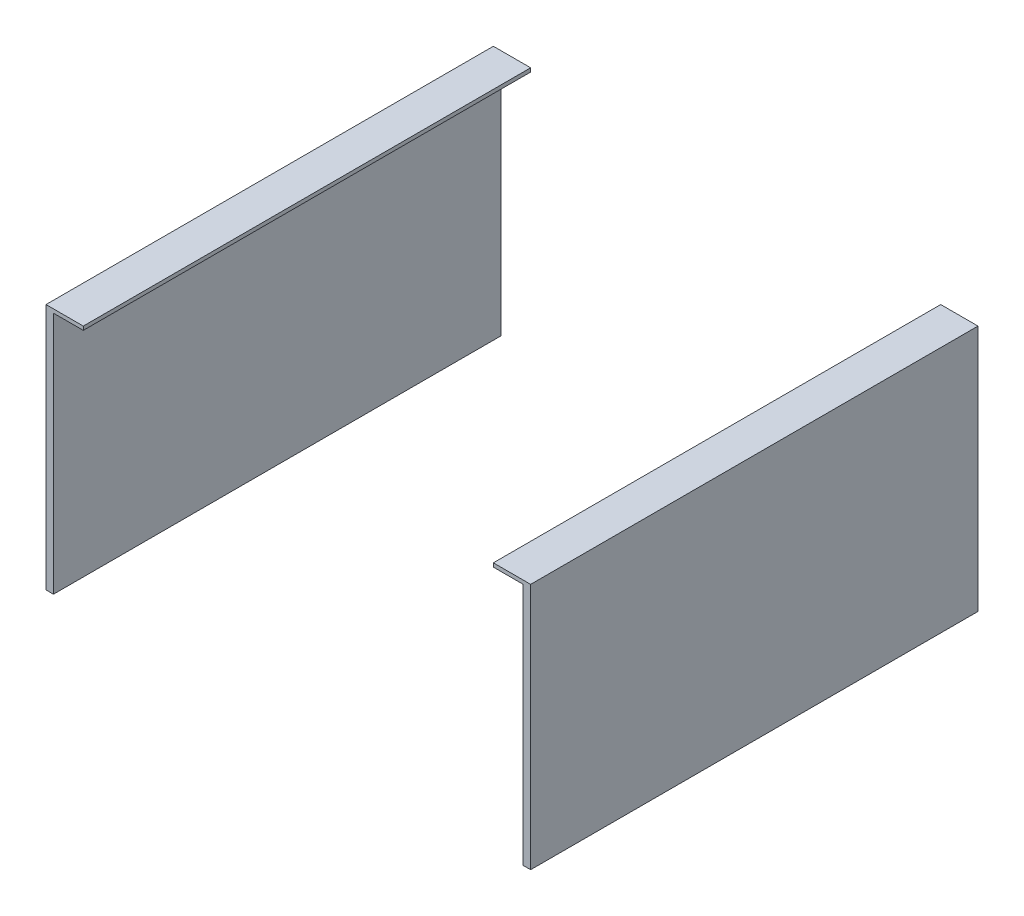
ISO-10303-21;
HEADER;
FILE_DESCRIPTION(('STEP AP214'),'2;1');
FILE_NAME('part.step','',(''),(''),'','','');
FILE_SCHEMA(('AUTOMOTIVE_DESIGN { 1 0 10303 214 1 1 1 1 }'));
ENDSEC;
DATA;
#1=APPLICATION_CONTEXT('core data for automotive mechanical design processes');
#2=APPLICATION_PROTOCOL_DEFINITION('international standard','automotive_design',2000,#1);
#3=PRODUCT_CONTEXT('',#1,'mechanical');
#4=PRODUCT('Part','Part','',(#3));
#5=PRODUCT_RELATED_PRODUCT_CATEGORY('part','',(#4));
#6=PRODUCT_DEFINITION_FORMATION('','',#4);
#7=PRODUCT_DEFINITION_CONTEXT('part definition',#1,'design');
#8=PRODUCT_DEFINITION('design','',#6,#7);
#9=PRODUCT_DEFINITION_SHAPE('','',#8);
#10=(LENGTH_UNIT() NAMED_UNIT(*) SI_UNIT(.MILLI.,.METRE.));
#11=(NAMED_UNIT(*) PLANE_ANGLE_UNIT() SI_UNIT($,.RADIAN.));
#12=(NAMED_UNIT(*) SI_UNIT($,.STERADIAN.) SOLID_ANGLE_UNIT());
#13=UNCERTAINTY_MEASURE_WITH_UNIT(LENGTH_MEASURE(1.E-05),#10,'distance_accuracy_value','');
#14=(GEOMETRIC_REPRESENTATION_CONTEXT(3) GLOBAL_UNCERTAINTY_ASSIGNED_CONTEXT((#13)) GLOBAL_UNIT_ASSIGNED_CONTEXT((#10,
#11,#12)) REPRESENTATION_CONTEXT('',''));
#15=CARTESIAN_POINT('',(0.,0.,0.));
#16=DIRECTION('',(0.,0.,1.));
#17=DIRECTION('',(1.,0.,0.));
#18=AXIS2_PLACEMENT_3D('',#15,#16,#17);
#19=CARTESIAN_POINT('',(-65.,66.3,-60.));
#20=DIRECTION('',(0.,0.,1.));
#21=DIRECTION('',(1.,0.,0.));
#22=AXIS2_PLACEMENT_3D('',#19,#20,#21);
#23=PLANE('',#22);
#24=DIRECTION('',(-1.,0.,0.));
#25=VECTOR('',#24,1.);
#26=CARTESIAN_POINT('',(-65.,66.3,-60.));
#27=LINE('',#26,#25);
#28=CARTESIAN_POINT('',(-55.,66.3,-60.));
#29=VERTEX_POINT('',#28);
#30=CARTESIAN_POINT('',(-65.,66.3,-60.));
#31=VERTEX_POINT('',#30);
#32=EDGE_CURVE('E147',#29,#31,#27,.T.);
#33=ORIENTED_EDGE('',*,*,#32,.F.);
#34=DIRECTION('',(0.,1.,0.));
#35=VECTOR('',#34,1.);
#36=CARTESIAN_POINT('',(-55.,-70.,-60.));
#37=LINE('',#36,#35);
#38=CARTESIAN_POINT('',(-55.,65.3,-60.));
#39=VERTEX_POINT('',#38);
#40=EDGE_CURVE('E63',#39,#29,#37,.T.);
#41=ORIENTED_EDGE('',*,*,#40,.F.);
#42=DIRECTION('',(-1.,0.,0.));
#43=VECTOR('',#42,1.);
#44=CARTESIAN_POINT('',(-65.,65.3,-60.));
#45=LINE('',#44,#43);
#46=CARTESIAN_POINT('',(-63.,65.3,-60.));
#47=VERTEX_POINT('',#46);
#48=EDGE_CURVE('E150',#39,#47,#45,.T.);
#49=ORIENTED_EDGE('',*,*,#48,.T.);
#50=DIRECTION('',(0.,-1.,0.));
#51=VECTOR('',#50,1.);
#52=CARTESIAN_POINT('',(-63.,66.3,-60.));
#53=LINE('',#52,#51);
#54=CARTESIAN_POINT('',(-63.,0.,-60.));
#55=VERTEX_POINT('',#54);
#56=EDGE_CURVE('E122',#47,#55,#53,.T.);
#57=ORIENTED_EDGE('',*,*,#56,.T.);
#58=DIRECTION('',(-1.,0.,0.));
#59=VECTOR('',#58,1.);
#60=CARTESIAN_POINT('',(-65.,0.,-60.));
#61=LINE('',#60,#59);
#62=CARTESIAN_POINT('',(-65.,0.,-60.));
#63=VERTEX_POINT('',#62);
#64=EDGE_CURVE('E118',#55,#63,#61,.T.);
#65=ORIENTED_EDGE('',*,*,#64,.T.);
#66=DIRECTION('',(0.,-1.,0.));
#67=VECTOR('',#66,1.);
#68=CARTESIAN_POINT('',(-65.,66.3,-60.));
#69=LINE('',#68,#67);
#70=EDGE_CURVE('E121',#31,#63,#69,.T.);
#71=ORIENTED_EDGE('',*,*,#70,.F.);
#72=EDGE_LOOP('',(#33,#41,#49,#57,#65,#71));
#73=FACE_BOUND('',#72,.T.);
#74=ADVANCED_FACE('F53',(#73),#23,.F.);
#75=CARTESIAN_POINT('',(-65.,66.3,60.));
#76=DIRECTION('',(0.,0.,-1.));
#77=DIRECTION('',(-1.,0.,0.));
#78=AXIS2_PLACEMENT_3D('',#75,#76,#77);
#79=PLANE('',#78);
#80=DIRECTION('',(-1.,0.,0.));
#81=VECTOR('',#80,1.);
#82=CARTESIAN_POINT('',(-63.,65.3,60.));
#83=LINE('',#82,#81);
#84=CARTESIAN_POINT('',(-55.,65.3,60.));
#85=VERTEX_POINT('',#84);
#86=CARTESIAN_POINT('',(-63.,65.3,60.));
#87=VERTEX_POINT('',#86);
#88=EDGE_CURVE('E56',#85,#87,#83,.T.);
#89=ORIENTED_EDGE('',*,*,#88,.F.);
#90=DIRECTION('',(0.,1.,0.));
#91=VECTOR('',#90,1.);
#92=CARTESIAN_POINT('',(-55.,-70.,60.));
#93=LINE('',#92,#91);
#94=CARTESIAN_POINT('',(-55.,66.3,60.));
#95=VERTEX_POINT('',#94);
#96=EDGE_CURVE('E126',#85,#95,#93,.T.);
#97=ORIENTED_EDGE('',*,*,#96,.T.);
#98=DIRECTION('',(1.,0.,0.));
#99=VECTOR('',#98,1.);
#100=CARTESIAN_POINT('',(-65.,66.3,60.));
#101=LINE('',#100,#99);
#102=CARTESIAN_POINT('',(-65.,66.3,60.));
#103=VERTEX_POINT('',#102);
#104=EDGE_CURVE('E161',#103,#95,#101,.T.);
#105=ORIENTED_EDGE('',*,*,#104,.F.);
#106=DIRECTION('',(0.,-1.,0.));
#107=VECTOR('',#106,1.);
#108=CARTESIAN_POINT('',(-65.,66.3,60.));
#109=LINE('',#108,#107);
#110=CARTESIAN_POINT('',(-65.,0.,60.));
#111=VERTEX_POINT('',#110);
#112=EDGE_CURVE('E144',#103,#111,#109,.T.);
#113=ORIENTED_EDGE('',*,*,#112,.T.);
#114=DIRECTION('',(1.,0.,0.));
#115=VECTOR('',#114,1.);
#116=CARTESIAN_POINT('',(-65.,0.,60.));
#117=LINE('',#116,#115);
#118=CARTESIAN_POINT('',(-63.,0.,60.));
#119=VERTEX_POINT('',#118);
#120=EDGE_CURVE('E138',#111,#119,#117,.T.);
#121=ORIENTED_EDGE('',*,*,#120,.T.);
#122=DIRECTION('',(0.,-1.,0.));
#123=VECTOR('',#122,1.);
#124=CARTESIAN_POINT('',(-63.,0.,60.));
#125=LINE('',#124,#123);
#126=EDGE_CURVE('E153',#87,#119,#125,.T.);
#127=ORIENTED_EDGE('',*,*,#126,.F.);
#128=EDGE_LOOP('',(#89,#97,#105,#113,#121,#127));
#129=FACE_BOUND('',#128,.T.);
#130=ADVANCED_FACE('F180',(#129),#79,.F.);
#131=CARTESIAN_POINT('',(0.,66.3,0.));
#132=DIRECTION('',(0.,-1.,0.));
#133=DIRECTION('',(0.,0.,-1.));
#134=AXIS2_PLACEMENT_3D('',#131,#132,#133);
#135=PLANE('',#134);
#136=ORIENTED_EDGE('',*,*,#104,.T.);
#137=DIRECTION('',(0.,0.,1.));
#138=VECTOR('',#137,1.);
#139=CARTESIAN_POINT('',(-55.,66.3,-60.));
#140=LINE('',#139,#138);
#141=EDGE_CURVE('E12',#29,#95,#140,.T.);
#142=ORIENTED_EDGE('',*,*,#141,.F.);
#143=ORIENTED_EDGE('',*,*,#32,.T.);
#144=DIRECTION('',(0.,0.,1.));
#145=VECTOR('',#144,1.);
#146=CARTESIAN_POINT('',(-65.,66.3,60.));
#147=LINE('',#146,#145);
#148=EDGE_CURVE('E111',#31,#103,#147,.T.);
#149=ORIENTED_EDGE('',*,*,#148,.T.);
#150=EDGE_LOOP('',(#136,#142,#143,#149));
#151=FACE_BOUND('',#150,.T.);
#152=ADVANCED_FACE('F173',(#151),#135,.F.);
#153=CARTESIAN_POINT('',(-63.,65.3,-76.3));
#154=DIRECTION('',(0.,1.,0.));
#155=DIRECTION('',(0.,0.,1.));
#156=AXIS2_PLACEMENT_3D('',#153,#154,#155);
#157=PLANE('',#156);
#158=ORIENTED_EDGE('',*,*,#48,.F.);
#159=DIRECTION('',(0.,0.,1.));
#160=VECTOR('',#159,1.);
#161=CARTESIAN_POINT('',(-55.,65.3,-76.3));
#162=LINE('',#161,#160);
#163=EDGE_CURVE('E72',#39,#85,#162,.T.);
#164=ORIENTED_EDGE('',*,*,#163,.T.);
#165=ORIENTED_EDGE('',*,*,#88,.T.);
#166=DIRECTION('',(0.,0.,1.));
#167=VECTOR('',#166,1.);
#168=CARTESIAN_POINT('',(-63.,65.3,-76.3));
#169=LINE('',#168,#167);
#170=EDGE_CURVE('E133',#47,#87,#169,.T.);
#171=ORIENTED_EDGE('',*,*,#170,.F.);
#172=EDGE_LOOP('',(#158,#164,#165,#171));
#173=FACE_BOUND('',#172,.T.);
#174=ADVANCED_FACE('F171',(#173),#157,.F.);
#175=CARTESIAN_POINT('',(0.,0.,0.));
#176=DIRECTION('',(0.,-1.,0.));
#177=DIRECTION('',(0.,0.,-1.));
#178=AXIS2_PLACEMENT_3D('',#175,#176,#177);
#179=PLANE('',#178);
#180=DIRECTION('',(0.,0.,-1.));
#181=VECTOR('',#180,1.);
#182=CARTESIAN_POINT('',(-63.,0.,0.));
#183=LINE('',#182,#181);
#184=EDGE_CURVE('E87',#119,#55,#183,.T.);
#185=ORIENTED_EDGE('',*,*,#184,.F.);
#186=ORIENTED_EDGE('',*,*,#120,.F.);
#187=DIRECTION('',(0.,0.,1.));
#188=VECTOR('',#187,1.);
#189=CARTESIAN_POINT('',(-65.,0.,60.));
#190=LINE('',#189,#188);
#191=EDGE_CURVE('E130',#63,#111,#190,.T.);
#192=ORIENTED_EDGE('',*,*,#191,.F.);
#193=ORIENTED_EDGE('',*,*,#64,.F.);
#194=EDGE_LOOP('',(#185,#186,#192,#193));
#195=FACE_BOUND('',#194,.T.);
#196=ADVANCED_FACE('F136',(#195),#179,.T.);
#197=CARTESIAN_POINT('',(-65.,66.3,60.));
#198=DIRECTION('',(1.,0.,0.));
#199=DIRECTION('',(0.,0.,-1.));
#200=AXIS2_PLACEMENT_3D('',#197,#198,#199);
#201=PLANE('',#200);
#202=ORIENTED_EDGE('',*,*,#191,.T.);
#203=ORIENTED_EDGE('',*,*,#112,.F.);
#204=ORIENTED_EDGE('',*,*,#148,.F.);
#205=ORIENTED_EDGE('',*,*,#70,.T.);
#206=EDGE_LOOP('',(#202,#203,#204,#205));
#207=FACE_BOUND('',#206,.T.);
#208=ADVANCED_FACE('F129',(#207),#201,.F.);
#209=CARTESIAN_POINT('',(-63.,0.,-76.3));
#210=DIRECTION('',(-1.,0.,0.));
#211=DIRECTION('',(0.,0.,1.));
#212=AXIS2_PLACEMENT_3D('',#209,#210,#211);
#213=PLANE('',#212);
#214=ORIENTED_EDGE('',*,*,#170,.T.);
#215=ORIENTED_EDGE('',*,*,#126,.T.);
#216=ORIENTED_EDGE('',*,*,#184,.T.);
#217=ORIENTED_EDGE('',*,*,#56,.F.);
#218=EDGE_LOOP('',(#214,#215,#216,#217));
#219=FACE_BOUND('',#218,.T.);
#220=ADVANCED_FACE('F169',(#219),#213,.F.);
#221=CARTESIAN_POINT('',(-55.,-70.,-60.));
#222=DIRECTION('',(-1.,0.,0.));
#223=DIRECTION('',(0.,0.,1.));
#224=AXIS2_PLACEMENT_3D('',#221,#222,#223);
#225=PLANE('',#224);
#226=ORIENTED_EDGE('',*,*,#40,.T.);
#227=ORIENTED_EDGE('',*,*,#141,.T.);
#228=ORIENTED_EDGE('',*,*,#96,.F.);
#229=ORIENTED_EDGE('',*,*,#163,.F.);
#230=EDGE_LOOP('',(#226,#227,#228,#229));
#231=FACE_BOUND('',#230,.T.);
#232=ADVANCED_FACE('F195',(#231),#225,.F.);
#233=CLOSED_SHELL('',(#74,#130,#152,#174,#196,#208,#220,#232));
#234=MANIFOLD_SOLID_BREP('B2',#233);
#235=CARTESIAN_POINT('',(0.,0.,0.));
#236=DIRECTION('',(0.,-1.,0.));
#237=DIRECTION('',(0.,0.,-1.));
#238=AXIS2_PLACEMENT_3D('',#235,#236,#237);
#239=PLANE('',#238);
#240=DIRECTION('',(0.,0.,1.));
#241=VECTOR('',#240,1.);
#242=CARTESIAN_POINT('',(63.,0.,0.));
#243=LINE('',#242,#241);
#244=CARTESIAN_POINT('',(63.,0.,-60.));
#245=VERTEX_POINT('',#244);
#246=CARTESIAN_POINT('',(63.,0.,60.));
#247=VERTEX_POINT('',#246);
#248=EDGE_CURVE('E271',#245,#247,#243,.T.);
#249=ORIENTED_EDGE('',*,*,#248,.F.);
#250=DIRECTION('',(-1.,0.,0.));
#251=VECTOR('',#250,1.);
#252=CARTESIAN_POINT('',(-65.,0.,-60.));
#253=LINE('',#252,#251);
#254=CARTESIAN_POINT('',(65.,0.,-60.));
#255=VERTEX_POINT('',#254);
#256=EDGE_CURVE('E345',#255,#245,#253,.T.);
#257=ORIENTED_EDGE('',*,*,#256,.F.);
#258=DIRECTION('',(0.,0.,-1.));
#259=VECTOR('',#258,1.);
#260=CARTESIAN_POINT('',(65.,0.,60.));
#261=LINE('',#260,#259);
#262=CARTESIAN_POINT('',(65.,0.,60.));
#263=VERTEX_POINT('',#262);
#264=EDGE_CURVE('E342',#263,#255,#261,.T.);
#265=ORIENTED_EDGE('',*,*,#264,.F.);
#266=DIRECTION('',(1.,0.,0.));
#267=VECTOR('',#266,1.);
#268=CARTESIAN_POINT('',(-65.,0.,60.));
#269=LINE('',#268,#267);
#270=EDGE_CURVE('E349',#247,#263,#269,.T.);
#271=ORIENTED_EDGE('',*,*,#270,.F.);
#272=EDGE_LOOP('',(#249,#257,#265,#271));
#273=FACE_BOUND('',#272,.T.);
#274=ADVANCED_FACE('F263',(#273),#239,.T.);
#275=CARTESIAN_POINT('',(65.,66.3,60.));
#276=DIRECTION('',(-1.,0.,0.));
#277=DIRECTION('',(0.,0.,1.));
#278=AXIS2_PLACEMENT_3D('',#275,#276,#277);
#279=PLANE('',#278);
#280=ORIENTED_EDGE('',*,*,#264,.T.);
#281=DIRECTION('',(0.,-1.,0.));
#282=VECTOR('',#281,1.);
#283=CARTESIAN_POINT('',(65.,66.3,-60.));
#284=LINE('',#283,#282);
#285=CARTESIAN_POINT('',(65.,66.3,-60.));
#286=VERTEX_POINT('',#285);
#287=EDGE_CURVE('E336',#286,#255,#284,.T.);
#288=ORIENTED_EDGE('',*,*,#287,.F.);
#289=DIRECTION('',(0.,0.,-1.));
#290=VECTOR('',#289,1.);
#291=CARTESIAN_POINT('',(65.,66.3,60.));
#292=LINE('',#291,#290);
#293=CARTESIAN_POINT('',(65.,66.3,60.));
#294=VERTEX_POINT('',#293);
#295=EDGE_CURVE('E338',#294,#286,#292,.T.);
#296=ORIENTED_EDGE('',*,*,#295,.F.);
#297=DIRECTION('',(0.,-1.,0.));
#298=VECTOR('',#297,1.);
#299=CARTESIAN_POINT('',(65.,66.3,60.));
#300=LINE('',#299,#298);
#301=EDGE_CURVE('E333',#294,#263,#300,.T.);
#302=ORIENTED_EDGE('',*,*,#301,.T.);
#303=EDGE_LOOP('',(#280,#288,#296,#302));
#304=FACE_BOUND('',#303,.T.);
#305=ADVANCED_FACE('F265',(#304),#279,.F.);
#306=CARTESIAN_POINT('',(63.,0.,-76.3));
#307=DIRECTION('',(1.,0.,0.));
#308=DIRECTION('',(0.,0.,-1.));
#309=AXIS2_PLACEMENT_3D('',#306,#307,#308);
#310=PLANE('',#309);
#311=ORIENTED_EDGE('',*,*,#248,.T.);
#312=DIRECTION('',(0.,1.,0.));
#313=VECTOR('',#312,1.);
#314=CARTESIAN_POINT('',(63.,0.,60.));
#315=LINE('',#314,#313);
#316=CARTESIAN_POINT('',(63.,65.3,60.));
#317=VERTEX_POINT('',#316);
#318=EDGE_CURVE('E355',#247,#317,#315,.T.);
#319=ORIENTED_EDGE('',*,*,#318,.T.);
#320=DIRECTION('',(0.,0.,1.));
#321=VECTOR('',#320,1.);
#322=CARTESIAN_POINT('',(63.,65.3,-76.3));
#323=LINE('',#322,#321);
#324=CARTESIAN_POINT('',(63.,65.3,-60.));
#325=VERTEX_POINT('',#324);
#326=EDGE_CURVE('E367',#325,#317,#323,.T.);
#327=ORIENTED_EDGE('',*,*,#326,.F.);
#328=DIRECTION('',(0.,1.,0.));
#329=VECTOR('',#328,1.);
#330=CARTESIAN_POINT('',(63.,66.3,-60.));
#331=LINE('',#330,#329);
#332=EDGE_CURVE('E285',#245,#325,#331,.T.);
#333=ORIENTED_EDGE('',*,*,#332,.F.);
#334=EDGE_LOOP('',(#311,#319,#327,#333));
#335=FACE_BOUND('',#334,.T.);
#336=ADVANCED_FACE('F354',(#335),#310,.F.);
#337=CARTESIAN_POINT('',(-63.,65.3,-76.3));
#338=DIRECTION('',(0.,1.,0.));
#339=DIRECTION('',(0.,0.,1.));
#340=AXIS2_PLACEMENT_3D('',#337,#338,#339);
#341=PLANE('',#340);
#342=DIRECTION('',(-1.,0.,0.));
#343=VECTOR('',#342,1.);
#344=CARTESIAN_POINT('',(-63.,65.3,60.));
#345=LINE('',#344,#343);
#346=CARTESIAN_POINT('',(55.,65.3,60.));
#347=VERTEX_POINT('',#346);
#348=EDGE_CURVE('E358',#317,#347,#345,.T.);
#349=ORIENTED_EDGE('',*,*,#348,.T.);
#350=DIRECTION('',(0.,0.,-1.));
#351=VECTOR('',#350,1.);
#352=CARTESIAN_POINT('',(55.,65.3,-76.3));
#353=LINE('',#352,#351);
#354=CARTESIAN_POINT('',(55.,65.3,-60.));
#355=VERTEX_POINT('',#354);
#356=EDGE_CURVE('E51',#347,#355,#353,.T.);
#357=ORIENTED_EDGE('',*,*,#356,.T.);
#358=DIRECTION('',(-1.,0.,0.));
#359=VECTOR('',#358,1.);
#360=CARTESIAN_POINT('',(-65.,65.3,-60.));
#361=LINE('',#360,#359);
#362=EDGE_CURVE('E346',#325,#355,#361,.T.);
#363=ORIENTED_EDGE('',*,*,#362,.F.);
#364=ORIENTED_EDGE('',*,*,#326,.T.);
#365=EDGE_LOOP('',(#349,#357,#363,#364));
#366=FACE_BOUND('',#365,.T.);
#367=ADVANCED_FACE('F373',(#366),#341,.F.);
#368=CARTESIAN_POINT('',(0.,66.3,0.));
#369=DIRECTION('',(0.,-1.,0.));
#370=DIRECTION('',(0.,0.,-1.));
#371=AXIS2_PLACEMENT_3D('',#368,#369,#370);
#372=PLANE('',#371);
#373=DIRECTION('',(-1.,0.,0.));
#374=VECTOR('',#373,1.);
#375=CARTESIAN_POINT('',(-65.,66.3,-60.));
#376=LINE('',#375,#374);
#377=CARTESIAN_POINT('',(55.,66.3,-60.));
#378=VERTEX_POINT('',#377);
#379=EDGE_CURVE('E329',#286,#378,#376,.T.);
#380=ORIENTED_EDGE('',*,*,#379,.T.);
#381=DIRECTION('',(0.,0.,-1.));
#382=VECTOR('',#381,1.);
#383=CARTESIAN_POINT('',(55.,66.3,-60.));
#384=LINE('',#383,#382);
#385=CARTESIAN_POINT('',(55.,66.3,60.));
#386=VERTEX_POINT('',#385);
#387=EDGE_CURVE('E317',#386,#378,#384,.T.);
#388=ORIENTED_EDGE('',*,*,#387,.F.);
#389=DIRECTION('',(1.,0.,0.));
#390=VECTOR('',#389,1.);
#391=CARTESIAN_POINT('',(-65.,66.3,60.));
#392=LINE('',#391,#390);
#393=EDGE_CURVE('E327',#386,#294,#392,.T.);
#394=ORIENTED_EDGE('',*,*,#393,.T.);
#395=ORIENTED_EDGE('',*,*,#295,.T.);
#396=EDGE_LOOP('',(#380,#388,#394,#395));
#397=FACE_BOUND('',#396,.T.);
#398=ADVANCED_FACE('F325',(#397),#372,.F.);
#399=CARTESIAN_POINT('',(-65.,66.3,60.));
#400=DIRECTION('',(0.,0.,-1.));
#401=DIRECTION('',(-1.,0.,0.));
#402=AXIS2_PLACEMENT_3D('',#399,#400,#401);
#403=PLANE('',#402);
#404=ORIENTED_EDGE('',*,*,#393,.F.);
#405=DIRECTION('',(0.,1.,0.));
#406=VECTOR('',#405,1.);
#407=CARTESIAN_POINT('',(55.,-70.,60.));
#408=LINE('',#407,#406);
#409=EDGE_CURVE('E314',#347,#386,#408,.T.);
#410=ORIENTED_EDGE('',*,*,#409,.F.);
#411=ORIENTED_EDGE('',*,*,#348,.F.);
#412=ORIENTED_EDGE('',*,*,#318,.F.);
#413=ORIENTED_EDGE('',*,*,#270,.T.);
#414=ORIENTED_EDGE('',*,*,#301,.F.);
#415=EDGE_LOOP('',(#404,#410,#411,#412,#413,#414));
#416=FACE_BOUND('',#415,.T.);
#417=ADVANCED_FACE('F331',(#416),#403,.F.);
#418=CARTESIAN_POINT('',(-65.,66.3,-60.));
#419=DIRECTION('',(0.,0.,1.));
#420=DIRECTION('',(1.,0.,0.));
#421=AXIS2_PLACEMENT_3D('',#418,#419,#420);
#422=PLANE('',#421);
#423=ORIENTED_EDGE('',*,*,#362,.T.);
#424=DIRECTION('',(0.,1.,0.));
#425=VECTOR('',#424,1.);
#426=CARTESIAN_POINT('',(55.,-70.,-60.));
#427=LINE('',#426,#425);
#428=EDGE_CURVE('E278',#355,#378,#427,.T.);
#429=ORIENTED_EDGE('',*,*,#428,.T.);
#430=ORIENTED_EDGE('',*,*,#379,.F.);
#431=ORIENTED_EDGE('',*,*,#287,.T.);
#432=ORIENTED_EDGE('',*,*,#256,.T.);
#433=ORIENTED_EDGE('',*,*,#332,.T.);
#434=EDGE_LOOP('',(#423,#429,#430,#431,#432,#433));
#435=FACE_BOUND('',#434,.T.);
#436=ADVANCED_FACE('F371',(#435),#422,.F.);
#437=CARTESIAN_POINT('',(55.,-70.,-60.));
#438=DIRECTION('',(1.,0.,0.));
#439=DIRECTION('',(0.,0.,-1.));
#440=AXIS2_PLACEMENT_3D('',#437,#438,#439);
#441=PLANE('',#440);
#442=ORIENTED_EDGE('',*,*,#409,.T.);
#443=ORIENTED_EDGE('',*,*,#387,.T.);
#444=ORIENTED_EDGE('',*,*,#428,.F.);
#445=ORIENTED_EDGE('',*,*,#356,.F.);
#446=EDGE_LOOP('',(#442,#443,#444,#445));
#447=FACE_BOUND('',#446,.T.);
#448=ADVANCED_FACE('F316',(#447),#441,.F.);
#449=CLOSED_SHELL('',(#274,#305,#336,#367,#398,#417,#436,#448));
#450=MANIFOLD_SOLID_BREP('B6',#449);
#451=ADVANCED_BREP_SHAPE_REPRESENTATION('',(#18,#234,#450),#14);
#452=SHAPE_DEFINITION_REPRESENTATION(#9,#451);
ENDSEC;
END-ISO-10303-21;
